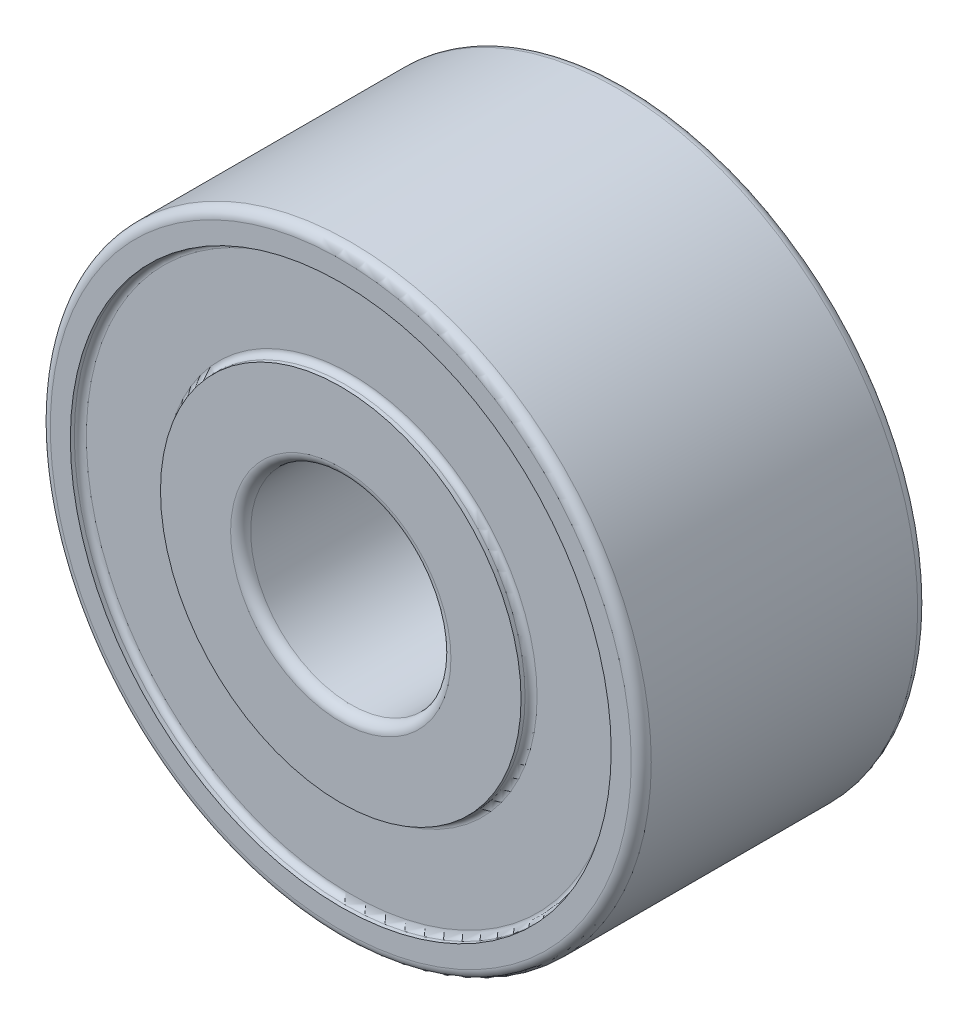
ISO-10303-21;
HEADER;
FILE_DESCRIPTION(('STEP AP214'),'2;1');
FILE_NAME('part.step','',(''),(''),'','','');
FILE_SCHEMA(('AUTOMOTIVE_DESIGN { 1 0 10303 214 1 1 1 1 }'));
ENDSEC;
DATA;
#1=APPLICATION_CONTEXT('core data for automotive mechanical design processes');
#2=APPLICATION_PROTOCOL_DEFINITION('international standard','automotive_design',2000,#1);
#3=PRODUCT_CONTEXT('',#1,'mechanical');
#4=PRODUCT('Part','Part','',(#3));
#5=PRODUCT_RELATED_PRODUCT_CATEGORY('part','',(#4));
#6=PRODUCT_DEFINITION_FORMATION('','',#4);
#7=PRODUCT_DEFINITION_CONTEXT('part definition',#1,'design');
#8=PRODUCT_DEFINITION('design','',#6,#7);
#9=PRODUCT_DEFINITION_SHAPE('','',#8);
#10=(LENGTH_UNIT() NAMED_UNIT(*) SI_UNIT(.MILLI.,.METRE.));
#11=(NAMED_UNIT(*) PLANE_ANGLE_UNIT() SI_UNIT($,.RADIAN.));
#12=(NAMED_UNIT(*) SI_UNIT($,.STERADIAN.) SOLID_ANGLE_UNIT());
#13=UNCERTAINTY_MEASURE_WITH_UNIT(LENGTH_MEASURE(1.E-05),#10,'distance_accuracy_value','');
#14=(GEOMETRIC_REPRESENTATION_CONTEXT(3) GLOBAL_UNCERTAINTY_ASSIGNED_CONTEXT((#13)) GLOBAL_UNIT_ASSIGNED_CONTEXT((#10,
#11,#12)) REPRESENTATION_CONTEXT('',''));
#15=CARTESIAN_POINT('',(0.,0.,0.));
#16=DIRECTION('',(0.,0.,1.));
#17=DIRECTION('',(1.,0.,0.));
#18=AXIS2_PLACEMENT_3D('',#15,#16,#17);
#19=CARTESIAN_POINT('',(0.,0.,14.3));
#20=DIRECTION('',(0.,0.,1.));
#21=DIRECTION('',(1.,0.,0.));
#22=AXIS2_PLACEMENT_3D('',#19,#20,#21);
#23=PLANE('',#22);
#24=CARTESIAN_POINT('',(0.,0.,14.3));
#25=DIRECTION('',(0.,0.,1.));
#26=DIRECTION('',(1.,0.,0.));
#27=AXIS2_PLACEMENT_3D('',#24,#25,#26);
#28=CIRCLE('',#27,5.5);
#29=CARTESIAN_POINT('',(5.5,0.,14.3));
#30=VERTEX_POINT('',#29);
#31=EDGE_CURVE('E66',#30,#30,#28,.F.);
#32=ORIENTED_EDGE('',*,*,#31,.T.);
#33=EDGE_LOOP('',(#32));
#34=FACE_BOUND('',#33,.T.);
#35=CARTESIAN_POINT('',(0.,0.,14.3));
#36=DIRECTION('',(0.,0.,1.));
#37=DIRECTION('',(1.,0.,0.));
#38=AXIS2_PLACEMENT_3D('',#35,#36,#37);
#39=CIRCLE('',#38,9.);
#40=CARTESIAN_POINT('',(9.,0.,14.3));
#41=VERTEX_POINT('',#40);
#42=EDGE_CURVE('E99',#41,#41,#39,.T.);
#43=ORIENTED_EDGE('',*,*,#42,.T.);
#44=EDGE_LOOP('',(#43));
#45=FACE_BOUND('',#44,.T.);
#46=ADVANCED_FACE('F34',(#34,#45),#23,.T.);
#47=CARTESIAN_POINT('',(0.,0.,0.));
#48=DIRECTION('',(0.,0.,1.));
#49=DIRECTION('',(1.,0.,0.));
#50=AXIS2_PLACEMENT_3D('',#47,#48,#49);
#51=PLANE('',#50);
#52=CARTESIAN_POINT('',(0.,0.,0.));
#53=DIRECTION('',(0.,0.,1.));
#54=DIRECTION('',(1.,0.,0.));
#55=AXIS2_PLACEMENT_3D('',#52,#53,#54);
#56=CIRCLE('',#55,5.5);
#57=CARTESIAN_POINT('',(5.5,0.,0.));
#58=VERTEX_POINT('',#57);
#59=EDGE_CURVE('E84',#58,#58,#56,.T.);
#60=ORIENTED_EDGE('',*,*,#59,.T.);
#61=EDGE_LOOP('',(#60));
#62=FACE_BOUND('',#61,.T.);
#63=CARTESIAN_POINT('',(0.,0.,0.));
#64=DIRECTION('',(0.,0.,-1.));
#65=DIRECTION('',(-1.,0.,0.));
#66=AXIS2_PLACEMENT_3D('',#63,#64,#65);
#67=CIRCLE('',#66,9.);
#68=CARTESIAN_POINT('',(-9.,0.,0.));
#69=VERTEX_POINT('',#68);
#70=EDGE_CURVE('E93',#69,#69,#67,.T.);
#71=ORIENTED_EDGE('',*,*,#70,.T.);
#72=EDGE_LOOP('',(#71));
#73=FACE_BOUND('',#72,.T.);
#74=ADVANCED_FACE('F120',(#62,#73),#51,.F.);
#75=CARTESIAN_POINT('',(0.,0.,14.3));
#76=DIRECTION('',(0.,0.,1.));
#77=DIRECTION('',(1.,0.,0.));
#78=AXIS2_PLACEMENT_3D('',#75,#76,#77);
#79=CIRCLE('',#78,13.5);
#80=CARTESIAN_POINT('',(13.5,0.,14.3));
#81=VERTEX_POINT('',#80);
#82=EDGE_CURVE('E96',#81,#81,#79,.T.);
#83=ORIENTED_EDGE('',*,*,#82,.F.);
#84=EDGE_LOOP('',(#83));
#85=FACE_BOUND('',#84,.T.);
#86=CARTESIAN_POINT('',(0.,0.,14.3));
#87=DIRECTION('',(0.,0.,1.));
#88=DIRECTION('',(1.,0.,0.));
#89=AXIS2_PLACEMENT_3D('',#86,#87,#88);
#90=CIRCLE('',#89,14.5);
#91=CARTESIAN_POINT('',(14.5,0.,14.3));
#92=VERTEX_POINT('',#91);
#93=EDGE_CURVE('E69',#92,#92,#90,.T.);
#94=ORIENTED_EDGE('',*,*,#93,.T.);
#95=EDGE_LOOP('',(#94));
#96=FACE_BOUND('',#95,.T.);
#97=ADVANCED_FACE('F123',(#85,#96),#23,.T.);
#98=CARTESIAN_POINT('',(0.,0.,0.));
#99=DIRECTION('',(0.,0.,-1.));
#100=DIRECTION('',(-1.,0.,0.));
#101=AXIS2_PLACEMENT_3D('',#98,#99,#100);
#102=CIRCLE('',#101,13.5);
#103=CARTESIAN_POINT('',(-13.5,0.,0.));
#104=VERTEX_POINT('',#103);
#105=EDGE_CURVE('E90',#104,#104,#102,.T.);
#106=ORIENTED_EDGE('',*,*,#105,.F.);
#107=EDGE_LOOP('',(#106));
#108=FACE_BOUND('',#107,.T.);
#109=CARTESIAN_POINT('',(0.,0.,0.));
#110=DIRECTION('',(0.,0.,1.));
#111=DIRECTION('',(1.,0.,0.));
#112=AXIS2_PLACEMENT_3D('',#109,#110,#111);
#113=CIRCLE('',#112,14.5);
#114=CARTESIAN_POINT('',(14.5,0.,0.));
#115=VERTEX_POINT('',#114);
#116=EDGE_CURVE('E87',#115,#115,#113,.F.);
#117=ORIENTED_EDGE('',*,*,#116,.T.);
#118=EDGE_LOOP('',(#117));
#119=FACE_BOUND('',#118,.T.);
#120=ADVANCED_FACE('F129',(#108,#119),#51,.F.);
#121=CARTESIAN_POINT('',(0.,0.,14.3));
#122=DIRECTION('',(0.,0.,-1.));
#123=DIRECTION('',(-1.,0.,0.));
#124=AXIS2_PLACEMENT_3D('',#121,#122,#123);
#125=CYLINDRICAL_SURFACE('',#124,15.);
#126=CARTESIAN_POINT('',(0.,0.,0.5));
#127=DIRECTION('',(0.,0.,1.));
#128=DIRECTION('',(1.,0.,0.));
#129=AXIS2_PLACEMENT_3D('',#126,#127,#128);
#130=CIRCLE('',#129,15.);
#131=CARTESIAN_POINT('',(15.,0.,0.5));
#132=VERTEX_POINT('',#131);
#133=EDGE_CURVE('E72',#132,#132,#130,.T.);
#134=ORIENTED_EDGE('',*,*,#133,.T.);
#135=EDGE_LOOP('',(#134));
#136=FACE_BOUND('',#135,.T.);
#137=CARTESIAN_POINT('',(0.,0.,13.8));
#138=DIRECTION('',(0.,0.,1.));
#139=DIRECTION('',(1.,0.,0.));
#140=AXIS2_PLACEMENT_3D('',#137,#138,#139);
#141=CIRCLE('',#140,15.);
#142=CARTESIAN_POINT('',(15.,0.,13.8));
#143=VERTEX_POINT('',#142);
#144=EDGE_CURVE('E75',#143,#143,#141,.F.);
#145=ORIENTED_EDGE('',*,*,#144,.T.);
#146=EDGE_LOOP('',(#145));
#147=FACE_BOUND('',#146,.T.);
#148=ADVANCED_FACE('F136',(#136,#147),#125,.T.);
#149=CARTESIAN_POINT('',(0.,0.,14.3));
#150=DIRECTION('',(0.,0.,-1.));
#151=DIRECTION('',(-1.,0.,0.));
#152=AXIS2_PLACEMENT_3D('',#149,#150,#151);
#153=CYLINDRICAL_SURFACE('',#152,5.);
#154=CARTESIAN_POINT('',(0.,0.,0.5));
#155=DIRECTION('',(0.,0.,1.));
#156=DIRECTION('',(1.,0.,0.));
#157=AXIS2_PLACEMENT_3D('',#154,#155,#156);
#158=CIRCLE('',#157,5.);
#159=CARTESIAN_POINT('',(5.,0.,0.5));
#160=VERTEX_POINT('',#159);
#161=EDGE_CURVE('E78',#160,#160,#158,.F.);
#162=ORIENTED_EDGE('',*,*,#161,.T.);
#163=EDGE_LOOP('',(#162));
#164=FACE_BOUND('',#163,.T.);
#165=CARTESIAN_POINT('',(0.,0.,13.8));
#166=DIRECTION('',(0.,0.,1.));
#167=DIRECTION('',(1.,0.,0.));
#168=AXIS2_PLACEMENT_3D('',#165,#166,#167);
#169=CIRCLE('',#168,5.);
#170=CARTESIAN_POINT('',(5.,0.,13.8));
#171=VERTEX_POINT('',#170);
#172=EDGE_CURVE('E81',#171,#171,#169,.T.);
#173=ORIENTED_EDGE('',*,*,#172,.T.);
#174=EDGE_LOOP('',(#173));
#175=FACE_BOUND('',#174,.T.);
#176=ADVANCED_FACE('F286',(#164,#175),#153,.F.);
#177=CARTESIAN_POINT('',(0.,0.,0.5));
#178=DIRECTION('',(0.,0.,1.));
#179=DIRECTION('',(1.,0.,0.));
#180=AXIS2_PLACEMENT_3D('',#177,#178,#179);
#181=TOROIDAL_SURFACE('',#180,5.5,0.5);
#182=ORIENTED_EDGE('',*,*,#161,.F.);
#183=EDGE_LOOP('',(#182));
#184=FACE_BOUND('',#183,.T.);
#185=ORIENTED_EDGE('',*,*,#59,.F.);
#186=EDGE_LOOP('',(#185));
#187=FACE_BOUND('',#186,.T.);
#188=ADVANCED_FACE('F277',(#184,#187),#181,.T.);
#189=CARTESIAN_POINT('',(0.,0.,0.5));
#190=DIRECTION('',(0.,0.,1.));
#191=DIRECTION('',(1.,0.,0.));
#192=AXIS2_PLACEMENT_3D('',#189,#190,#191);
#193=TOROIDAL_SURFACE('',#192,14.5,0.5);
#194=ORIENTED_EDGE('',*,*,#116,.F.);
#195=EDGE_LOOP('',(#194));
#196=FACE_BOUND('',#195,.T.);
#197=ORIENTED_EDGE('',*,*,#133,.F.);
#198=EDGE_LOOP('',(#197));
#199=FACE_BOUND('',#198,.T.);
#200=ADVANCED_FACE('F155',(#196,#199),#193,.T.);
#201=CARTESIAN_POINT('',(0.,0.,13.8));
#202=DIRECTION('',(0.,0.,1.));
#203=DIRECTION('',(1.,0.,0.));
#204=AXIS2_PLACEMENT_3D('',#201,#202,#203);
#205=TOROIDAL_SURFACE('',#204,5.5,0.5);
#206=ORIENTED_EDGE('',*,*,#31,.F.);
#207=EDGE_LOOP('',(#206));
#208=FACE_BOUND('',#207,.T.);
#209=ORIENTED_EDGE('',*,*,#172,.F.);
#210=EDGE_LOOP('',(#209));
#211=FACE_BOUND('',#210,.T.);
#212=ADVANCED_FACE('F145',(#208,#211),#205,.T.);
#213=CARTESIAN_POINT('',(0.,0.,13.8));
#214=DIRECTION('',(0.,0.,1.));
#215=DIRECTION('',(1.,0.,0.));
#216=AXIS2_PLACEMENT_3D('',#213,#214,#215);
#217=TOROIDAL_SURFACE('',#216,14.5,0.5);
#218=ORIENTED_EDGE('',*,*,#144,.F.);
#219=EDGE_LOOP('',(#218));
#220=FACE_BOUND('',#219,.T.);
#221=ORIENTED_EDGE('',*,*,#93,.F.);
#222=EDGE_LOOP('',(#221));
#223=FACE_BOUND('',#222,.T.);
#224=ADVANCED_FACE('F142',(#220,#223),#217,.T.);
#225=CARTESIAN_POINT('',(0.,0.,0.5));
#226=DIRECTION('',(0.,0.,-1.));
#227=DIRECTION('',(-1.,0.,0.));
#228=AXIS2_PLACEMENT_3D('',#225,#226,#227);
#229=CYLINDRICAL_SURFACE('',#228,13.5);
#230=CARTESIAN_POINT('',(0.,0.,0.2));
#231=DIRECTION('',(0.,0.,-1.));
#232=DIRECTION('',(-1.,0.,0.));
#233=AXIS2_PLACEMENT_3D('',#230,#231,#232);
#234=CIRCLE('',#233,13.5);
#235=CARTESIAN_POINT('',(-13.5,0.,0.2));
#236=VERTEX_POINT('',#235);
#237=EDGE_CURVE('E57',#236,#236,#234,.F.);
#238=ORIENTED_EDGE('',*,*,#237,.T.);
#239=EDGE_LOOP('',(#238));
#240=FACE_BOUND('',#239,.T.);
#241=ORIENTED_EDGE('',*,*,#105,.T.);
#242=EDGE_LOOP('',(#241));
#243=FACE_BOUND('',#242,.T.);
#244=ADVANCED_FACE('F144',(#240,#243),#229,.F.);
#245=CARTESIAN_POINT('',(0.,0.,0.5));
#246=DIRECTION('',(0.,0.,-1.));
#247=DIRECTION('',(-1.,0.,0.));
#248=AXIS2_PLACEMENT_3D('',#245,#246,#247);
#249=PLANE('',#248);
#250=CARTESIAN_POINT('',(0.,0.,0.5));
#251=DIRECTION('',(0.,0.,-1.));
#252=DIRECTION('',(-1.,0.,0.));
#253=AXIS2_PLACEMENT_3D('',#250,#251,#252);
#254=CIRCLE('',#253,13.2);
#255=CARTESIAN_POINT('',(-13.2,0.,0.5));
#256=VERTEX_POINT('',#255);
#257=EDGE_CURVE('E60',#256,#256,#254,.T.);
#258=ORIENTED_EDGE('',*,*,#257,.T.);
#259=EDGE_LOOP('',(#258));
#260=FACE_BOUND('',#259,.T.);
#261=CARTESIAN_POINT('',(0.,0.,0.5));
#262=DIRECTION('',(0.,0.,-1.));
#263=DIRECTION('',(-1.,0.,0.));
#264=AXIS2_PLACEMENT_3D('',#261,#262,#263);
#265=CIRCLE('',#264,9.3);
#266=CARTESIAN_POINT('',(-9.3,0.,0.5));
#267=VERTEX_POINT('',#266);
#268=EDGE_CURVE('E63',#267,#267,#265,.F.);
#269=ORIENTED_EDGE('',*,*,#268,.T.);
#270=EDGE_LOOP('',(#269));
#271=FACE_BOUND('',#270,.T.);
#272=ADVANCED_FACE('F152',(#260,#271),#249,.T.);
#273=CARTESIAN_POINT('',(0.,0.,0.5));
#274=DIRECTION('',(0.,0.,-1.));
#275=DIRECTION('',(-1.,0.,0.));
#276=AXIS2_PLACEMENT_3D('',#273,#274,#275);
#277=CYLINDRICAL_SURFACE('',#276,9.);
#278=CARTESIAN_POINT('',(0.,0.,0.2));
#279=DIRECTION('',(0.,0.,-1.));
#280=DIRECTION('',(-1.,0.,0.));
#281=AXIS2_PLACEMENT_3D('',#278,#279,#280);
#282=CIRCLE('',#281,9.);
#283=CARTESIAN_POINT('',(-9.,0.,0.2));
#284=VERTEX_POINT('',#283);
#285=EDGE_CURVE('E54',#284,#284,#282,.T.);
#286=ORIENTED_EDGE('',*,*,#285,.T.);
#287=EDGE_LOOP('',(#286));
#288=FACE_BOUND('',#287,.T.);
#289=ORIENTED_EDGE('',*,*,#70,.F.);
#290=EDGE_LOOP('',(#289));
#291=FACE_BOUND('',#290,.T.);
#292=ADVANCED_FACE('F212',(#288,#291),#277,.T.);
#293=CARTESIAN_POINT('',(0.,0.,13.8));
#294=DIRECTION('',(0.,0.,1.));
#295=DIRECTION('',(1.,0.,0.));
#296=AXIS2_PLACEMENT_3D('',#293,#294,#295);
#297=CYLINDRICAL_SURFACE('',#296,13.5);
#298=CARTESIAN_POINT('',(0.,0.,14.1));
#299=DIRECTION('',(0.,0.,1.));
#300=DIRECTION('',(1.,0.,0.));
#301=AXIS2_PLACEMENT_3D('',#298,#299,#300);
#302=CIRCLE('',#301,13.5);
#303=CARTESIAN_POINT('',(13.5,0.,14.1));
#304=VERTEX_POINT('',#303);
#305=EDGE_CURVE('E41',#304,#304,#302,.F.);
#306=ORIENTED_EDGE('',*,*,#305,.T.);
#307=EDGE_LOOP('',(#306));
#308=FACE_BOUND('',#307,.T.);
#309=ORIENTED_EDGE('',*,*,#82,.T.);
#310=EDGE_LOOP('',(#309));
#311=FACE_BOUND('',#310,.T.);
#312=ADVANCED_FACE('F116',(#308,#311),#297,.F.);
#313=CARTESIAN_POINT('',(0.,0.,13.8));
#314=DIRECTION('',(0.,0.,1.));
#315=DIRECTION('',(1.,0.,0.));
#316=AXIS2_PLACEMENT_3D('',#313,#314,#315);
#317=PLANE('',#316);
#318=CARTESIAN_POINT('',(0.,0.,13.8));
#319=DIRECTION('',(0.,0.,1.));
#320=DIRECTION('',(1.,0.,0.));
#321=AXIS2_PLACEMENT_3D('',#318,#319,#320);
#322=CIRCLE('',#321,13.2);
#323=CARTESIAN_POINT('',(13.2,0.,13.8));
#324=VERTEX_POINT('',#323);
#325=EDGE_CURVE('E45',#324,#324,#322,.T.);
#326=ORIENTED_EDGE('',*,*,#325,.T.);
#327=EDGE_LOOP('',(#326));
#328=FACE_BOUND('',#327,.T.);
#329=CARTESIAN_POINT('',(0.,0.,13.8));
#330=DIRECTION('',(0.,0.,1.));
#331=DIRECTION('',(1.,0.,0.));
#332=AXIS2_PLACEMENT_3D('',#329,#330,#331);
#333=CIRCLE('',#332,9.3);
#334=CARTESIAN_POINT('',(9.3,0.,13.8));
#335=VERTEX_POINT('',#334);
#336=EDGE_CURVE('E49',#335,#335,#333,.F.);
#337=ORIENTED_EDGE('',*,*,#336,.T.);
#338=EDGE_LOOP('',(#337));
#339=FACE_BOUND('',#338,.T.);
#340=ADVANCED_FACE('F107',(#328,#339),#317,.T.);
#341=CARTESIAN_POINT('',(0.,0.,13.8));
#342=DIRECTION('',(0.,0.,1.));
#343=DIRECTION('',(1.,0.,0.));
#344=AXIS2_PLACEMENT_3D('',#341,#342,#343);
#345=CYLINDRICAL_SURFACE('',#344,9.);
#346=CARTESIAN_POINT('',(0.,0.,14.1));
#347=DIRECTION('',(0.,0.,1.));
#348=DIRECTION('',(1.,0.,0.));
#349=AXIS2_PLACEMENT_3D('',#346,#347,#348);
#350=CIRCLE('',#349,9.);
#351=CARTESIAN_POINT('',(9.,0.,14.1));
#352=VERTEX_POINT('',#351);
#353=EDGE_CURVE('E10',#352,#352,#350,.T.);
#354=ORIENTED_EDGE('',*,*,#353,.T.);
#355=EDGE_LOOP('',(#354));
#356=FACE_BOUND('',#355,.T.);
#357=ORIENTED_EDGE('',*,*,#42,.F.);
#358=EDGE_LOOP('',(#357));
#359=FACE_BOUND('',#358,.T.);
#360=ADVANCED_FACE('F104',(#356,#359),#345,.T.);
#361=CARTESIAN_POINT('',(0.,0.,0.2));
#362=DIRECTION('',(0.,0.,-1.));
#363=DIRECTION('',(-1.,0.,0.));
#364=AXIS2_PLACEMENT_3D('',#361,#362,#363);
#365=TOROIDAL_SURFACE('',#364,13.2,0.3);
#366=ORIENTED_EDGE('',*,*,#237,.F.);
#367=EDGE_LOOP('',(#366));
#368=FACE_BOUND('',#367,.T.);
#369=ORIENTED_EDGE('',*,*,#257,.F.);
#370=EDGE_LOOP('',(#369));
#371=FACE_BOUND('',#370,.T.);
#372=ADVANCED_FACE('F106',(#368,#371),#365,.F.);
#373=CARTESIAN_POINT('',(0.,0.,0.2));
#374=DIRECTION('',(0.,0.,-1.));
#375=DIRECTION('',(-1.,0.,0.));
#376=AXIS2_PLACEMENT_3D('',#373,#374,#375);
#377=TOROIDAL_SURFACE('',#376,9.3,0.3);
#378=ORIENTED_EDGE('',*,*,#268,.F.);
#379=EDGE_LOOP('',(#378));
#380=FACE_BOUND('',#379,.T.);
#381=ORIENTED_EDGE('',*,*,#285,.F.);
#382=EDGE_LOOP('',(#381));
#383=FACE_BOUND('',#382,.T.);
#384=ADVANCED_FACE('F113',(#380,#383),#377,.F.);
#385=CARTESIAN_POINT('',(0.,0.,14.1));
#386=DIRECTION('',(0.,0.,1.));
#387=DIRECTION('',(1.,0.,0.));
#388=AXIS2_PLACEMENT_3D('',#385,#386,#387);
#389=TOROIDAL_SURFACE('',#388,13.2,0.3);
#390=ORIENTED_EDGE('',*,*,#305,.F.);
#391=EDGE_LOOP('',(#390));
#392=FACE_BOUND('',#391,.T.);
#393=ORIENTED_EDGE('',*,*,#325,.F.);
#394=EDGE_LOOP('',(#393));
#395=FACE_BOUND('',#394,.T.);
#396=ADVANCED_FACE('F162',(#392,#395),#389,.F.);
#397=CARTESIAN_POINT('',(0.,0.,14.1));
#398=DIRECTION('',(0.,0.,1.));
#399=DIRECTION('',(1.,0.,0.));
#400=AXIS2_PLACEMENT_3D('',#397,#398,#399);
#401=TOROIDAL_SURFACE('',#400,9.3,0.3);
#402=ORIENTED_EDGE('',*,*,#336,.F.);
#403=EDGE_LOOP('',(#402));
#404=FACE_BOUND('',#403,.T.);
#405=ORIENTED_EDGE('',*,*,#353,.F.);
#406=EDGE_LOOP('',(#405));
#407=FACE_BOUND('',#406,.T.);
#408=ADVANCED_FACE('F36',(#404,#407),#401,.F.);
#409=CLOSED_SHELL('',(#46,#74,#97,#120,#148,#176,#188,#200,#212,#224,#244,#272,#292,#312,#340,
#360,#372,#384,#396,#408));
#410=MANIFOLD_SOLID_BREP('B2',#409);
#411=ADVANCED_BREP_SHAPE_REPRESENTATION('',(#18,#410),#14);
#412=SHAPE_DEFINITION_REPRESENTATION(#9,#411);
ENDSEC;
END-ISO-10303-21;
